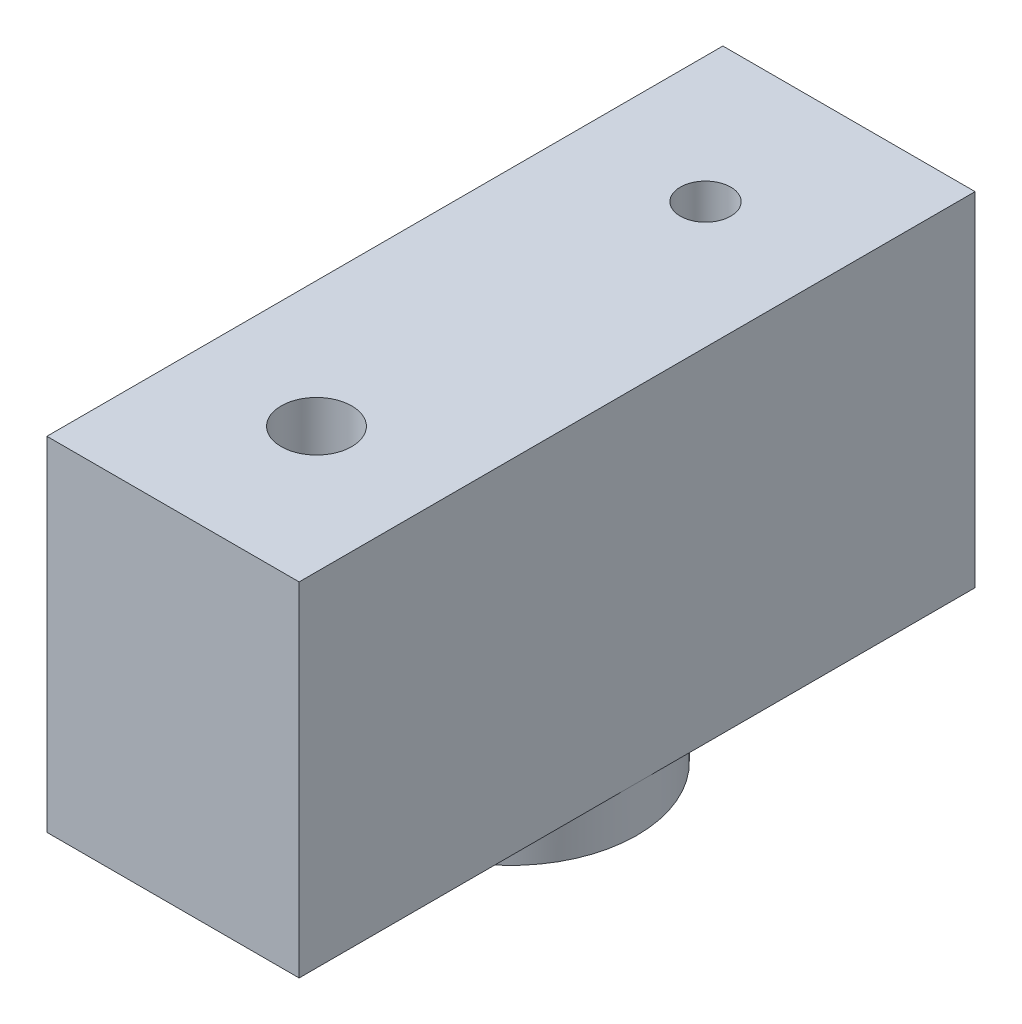
ISO-10303-21;
HEADER;
FILE_DESCRIPTION(('STEP AP214'),'2;1');
FILE_NAME('part.step','',(''),(''),'','','');
FILE_SCHEMA(('AUTOMOTIVE_DESIGN { 1 0 10303 214 1 1 1 1 }'));
ENDSEC;
DATA;
#1=APPLICATION_CONTEXT('core data for automotive mechanical design processes');
#2=APPLICATION_PROTOCOL_DEFINITION('international standard','automotive_design',2000,#1);
#3=PRODUCT_CONTEXT('',#1,'mechanical');
#4=PRODUCT('Part','Part','',(#3));
#5=PRODUCT_RELATED_PRODUCT_CATEGORY('part','',(#4));
#6=PRODUCT_DEFINITION_FORMATION('','',#4);
#7=PRODUCT_DEFINITION_CONTEXT('part definition',#1,'design');
#8=PRODUCT_DEFINITION('design','',#6,#7);
#9=PRODUCT_DEFINITION_SHAPE('','',#8);
#10=(LENGTH_UNIT() NAMED_UNIT(*) SI_UNIT(.MILLI.,.METRE.));
#11=(NAMED_UNIT(*) PLANE_ANGLE_UNIT() SI_UNIT($,.RADIAN.));
#12=(NAMED_UNIT(*) SI_UNIT($,.STERADIAN.) SOLID_ANGLE_UNIT());
#13=UNCERTAINTY_MEASURE_WITH_UNIT(LENGTH_MEASURE(1.E-05),#10,'distance_accuracy_value','');
#14=(GEOMETRIC_REPRESENTATION_CONTEXT(3) GLOBAL_UNCERTAINTY_ASSIGNED_CONTEXT((#13)) GLOBAL_UNIT_ASSIGNED_CONTEXT((#10,
#11,#12)) REPRESENTATION_CONTEXT('',''));
#15=CARTESIAN_POINT('',(0.,0.,0.));
#16=DIRECTION('',(0.,0.,1.));
#17=DIRECTION('',(1.,0.,0.));
#18=AXIS2_PLACEMENT_3D('',#15,#16,#17);
#19=CARTESIAN_POINT('',(0.,7.5,0.));
#20=DIRECTION('',(0.,-1.,0.));
#21=DIRECTION('',(0.,0.,-1.));
#22=AXIS2_PLACEMENT_3D('',#19,#20,#21);
#23=CYLINDRICAL_SURFACE('',#22,12.5);
#24=CARTESIAN_POINT('',(0.,4.5,0.));
#25=DIRECTION('',(0.,1.,0.));
#26=DIRECTION('',(0.,0.,1.));
#27=AXIS2_PLACEMENT_3D('',#24,#25,#26);
#28=CIRCLE('',#27,12.5);
#29=CARTESIAN_POINT('',(-12.5,4.5,0.));
#30=VERTEX_POINT('',#29);
#31=CARTESIAN_POINT('',(-10.1748508820344,4.5,7.2610198683356));
#32=VERTEX_POINT('',#31);
#33=EDGE_CURVE('E189',#30,#32,#28,.T.);
#34=ORIENTED_EDGE('',*,*,#33,.F.);
#35=CARTESIAN_POINT('',(12.5,4.5,0.));
#36=VERTEX_POINT('',#35);
#37=EDGE_CURVE('E179',#36,#30,#28,.T.);
#38=ORIENTED_EDGE('',*,*,#37,.F.);
#39=CARTESIAN_POINT('',(-3.34312283266417,4.5,12.0446473475033));
#40=VERTEX_POINT('',#39);
#41=EDGE_CURVE('E173',#40,#36,#28,.T.);
#42=ORIENTED_EDGE('',*,*,#41,.F.);
#43=DIRECTION('',(0.,-1.,0.));
#44=VECTOR('',#43,1.);
#45=CARTESIAN_POINT('',(-3.34312283266417,7.5,12.0446473475033));
#46=LINE('',#45,#44);
#47=CARTESIAN_POINT('',(-3.34312283266417,0.,12.0446473475033));
#48=VERTEX_POINT('',#47);
#49=EDGE_CURVE('E56',#40,#48,#46,.T.);
#50=ORIENTED_EDGE('',*,*,#49,.T.);
#51=CARTESIAN_POINT('',(0.,0.,0.));
#52=DIRECTION('',(0.,1.,0.));
#53=DIRECTION('',(0.,0.,1.));
#54=AXIS2_PLACEMENT_3D('',#51,#52,#53);
#55=CIRCLE('',#54,12.5);
#56=CARTESIAN_POINT('',(-10.1748508820344,0.,7.26101986833561));
#57=VERTEX_POINT('',#56);
#58=EDGE_CURVE('E96',#48,#57,#55,.T.);
#59=ORIENTED_EDGE('',*,*,#58,.T.);
#60=DIRECTION('',(0.,-1.,0.));
#61=VECTOR('',#60,1.);
#62=CARTESIAN_POINT('',(-10.1748508820344,7.5,7.26101986833561));
#63=LINE('',#62,#61);
#64=EDGE_CURVE('E80',#32,#57,#63,.T.);
#65=ORIENTED_EDGE('',*,*,#64,.F.);
#66=EDGE_LOOP('',(#34,#38,#42,#50,#59,#65));
#67=FACE_BOUND('',#66,.T.);
#68=ADVANCED_FACE('F46',(#67),#23,.T.);
#69=CARTESIAN_POINT('',(0.,7.5,0.));
#70=DIRECTION('',(0.,-1.,0.));
#71=DIRECTION('',(0.,0.,-1.));
#72=AXIS2_PLACEMENT_3D('',#69,#70,#71);
#73=CYLINDRICAL_SURFACE('',#72,10.);
#74=DIRECTION('',(0.,-1.,0.));
#75=VECTOR('',#74,1.);
#76=CARTESIAN_POINT('',(-8.62913745592333,7.5,5.05351231984063));
#77=LINE('',#76,#75);
#78=CARTESIAN_POINT('',(-8.62913745592333,7.5,5.05351231984063));
#79=VERTEX_POINT('',#78);
#80=CARTESIAN_POINT('',(-8.62913745592333,0.,5.05351231984063));
#81=VERTEX_POINT('',#80);
#82=EDGE_CURVE('E93',#79,#81,#77,.T.);
#83=ORIENTED_EDGE('',*,*,#82,.T.);
#84=CARTESIAN_POINT('',(0.,0.,0.));
#85=DIRECTION('',(0.,-1.,0.));
#86=DIRECTION('',(0.,0.,1.));
#87=AXIS2_PLACEMENT_3D('',#84,#85,#86);
#88=CIRCLE('',#87,10.);
#89=CARTESIAN_POINT('',(-1.79740940655315,0.,9.83713979900836));
#90=VERTEX_POINT('',#89);
#91=EDGE_CURVE('E108',#81,#90,#88,.T.);
#92=ORIENTED_EDGE('',*,*,#91,.T.);
#93=DIRECTION('',(0.,-1.,0.));
#94=VECTOR('',#93,1.);
#95=CARTESIAN_POINT('',(-1.79740940655315,7.5,9.83713979900836));
#96=LINE('',#95,#94);
#97=CARTESIAN_POINT('',(-1.79740940655315,7.5,9.83713979900836));
#98=VERTEX_POINT('',#97);
#99=EDGE_CURVE('E12',#98,#90,#96,.T.);
#100=ORIENTED_EDGE('',*,*,#99,.F.);
#101=CARTESIAN_POINT('',(0.,7.5,0.));
#102=DIRECTION('',(0.,-1.,0.));
#103=DIRECTION('',(0.,0.,1.));
#104=AXIS2_PLACEMENT_3D('',#101,#102,#103);
#105=CIRCLE('',#104,10.);
#106=EDGE_CURVE('E110',#79,#98,#105,.T.);
#107=ORIENTED_EDGE('',*,*,#106,.F.);
#108=EDGE_LOOP('',(#83,#92,#100,#107));
#109=FACE_BOUND('',#108,.T.);
#110=ADVANCED_FACE('F48',(#109),#73,.F.);
#111=CARTESIAN_POINT('',(-1.79740940655314,7.5,9.83713979900836));
#112=DIRECTION('',(0.819152044288991,0.,0.573576436351047));
#113=DIRECTION('',(0.573576436351047,0.,-0.819152044288991));
#114=AXIS2_PLACEMENT_3D('',#111,#112,#113);
#115=PLANE('',#114);
#116=ORIENTED_EDGE('',*,*,#99,.T.);
#117=DIRECTION('',(-0.573576436351047,0.,0.819152044288991));
#118=VECTOR('',#117,1.);
#119=CARTESIAN_POINT('',(-1.79740940655314,0.,9.83713979900836));
#120=LINE('',#119,#118);
#121=EDGE_CURVE('E103',#90,#48,#120,.T.);
#122=ORIENTED_EDGE('',*,*,#121,.T.);
#123=ORIENTED_EDGE('',*,*,#49,.F.);
#124=DIRECTION('',(-0.573576436351046,0.,0.819152044288992));
#125=VECTOR('',#124,1.);
#126=CARTESIAN_POINT('',(-1.79740940655315,4.5,9.83713979900836));
#127=LINE('',#126,#125);
#128=CARTESIAN_POINT('',(-12.5,4.5,25.1220232220164));
#129=VERTEX_POINT('',#128);
#130=EDGE_CURVE('E249',#40,#129,#127,.T.);
#131=ORIENTED_EDGE('',*,*,#130,.T.);
#132=DIRECTION('',(0.,1.,0.));
#133=VECTOR('',#132,1.);
#134=CARTESIAN_POINT('',(-12.5,4.5,25.1220232220164));
#135=LINE('',#134,#133);
#136=CARTESIAN_POINT('',(-12.5,17.5,25.1220232220164));
#137=VERTEX_POINT('',#136);
#138=EDGE_CURVE('E226',#129,#137,#135,.T.);
#139=ORIENTED_EDGE('',*,*,#138,.T.);
#140=DIRECTION('',(-0.573576436351051,0.,0.819152044288989));
#141=VECTOR('',#140,1.);
#142=CARTESIAN_POINT('',(-12.5,17.5,25.1220232220164));
#143=LINE('',#142,#141);
#144=CARTESIAN_POINT('',(-1.79740940655303,17.5,9.83713979900838));
#145=VERTEX_POINT('',#144);
#146=EDGE_CURVE('E298',#145,#137,#143,.T.);
#147=ORIENTED_EDGE('',*,*,#146,.F.);
#148=DIRECTION('',(0.,-1.,0.));
#149=VECTOR('',#148,1.);
#150=CARTESIAN_POINT('',(-1.79740940655303,17.5,9.83713979900838));
#151=LINE('',#150,#149);
#152=EDGE_CURVE('E283',#145,#98,#151,.T.);
#153=ORIENTED_EDGE('',*,*,#152,.T.);
#154=EDGE_LOOP('',(#116,#122,#123,#131,#139,#147,#153));
#155=FACE_BOUND('',#154,.T.);
#156=ADVANCED_FACE('F311',(#155),#115,.F.);
#157=CARTESIAN_POINT('',(-8.62913745592333,7.5,5.05351231984063));
#158=DIRECTION('',(-0.81915204428899,0.,-0.573576436351049));
#159=DIRECTION('',(-0.573576436351049,0.,0.81915204428899));
#160=AXIS2_PLACEMENT_3D('',#157,#158,#159);
#161=PLANE('',#160);
#162=ORIENTED_EDGE('',*,*,#82,.F.);
#163=DIRECTION('',(0.,-1.,0.));
#164=VECTOR('',#163,1.);
#165=CARTESIAN_POINT('',(-8.62913745592333,17.5,5.05351231984063));
#166=LINE('',#165,#164);
#167=CARTESIAN_POINT('',(-8.62913745592333,17.5,5.05351231984063));
#168=VERTEX_POINT('',#167);
#169=EDGE_CURVE('E126',#168,#79,#166,.T.);
#170=ORIENTED_EDGE('',*,*,#169,.F.);
#171=DIRECTION('',(0.573576436351051,0.,-0.819152044288989));
#172=VECTOR('',#171,1.);
#173=CARTESIAN_POINT('',(-8.62913745592333,17.5,5.05351231984063));
#174=LINE('',#173,#172);
#175=CARTESIAN_POINT('',(-12.5,17.5,10.5816769465364));
#176=VERTEX_POINT('',#175);
#177=EDGE_CURVE('E286',#176,#168,#174,.T.);
#178=ORIENTED_EDGE('',*,*,#177,.F.);
#179=DIRECTION('',(0.,1.,0.));
#180=VECTOR('',#179,1.);
#181=CARTESIAN_POINT('',(-12.5,4.5,10.5816769465364));
#182=LINE('',#181,#180);
#183=CARTESIAN_POINT('',(-12.5,4.5,10.5816769465364));
#184=VERTEX_POINT('',#183);
#185=EDGE_CURVE('E229',#184,#176,#182,.T.);
#186=ORIENTED_EDGE('',*,*,#185,.F.);
#187=DIRECTION('',(0.573576436351051,0.,-0.819152044288988));
#188=VECTOR('',#187,1.);
#189=CARTESIAN_POINT('',(-8.62913745592333,4.5,5.05351231984063));
#190=LINE('',#189,#188);
#191=EDGE_CURVE('E89',#184,#32,#190,.T.);
#192=ORIENTED_EDGE('',*,*,#191,.T.);
#193=ORIENTED_EDGE('',*,*,#64,.T.);
#194=DIRECTION('',(0.573576436351049,0.,-0.81915204428899));
#195=VECTOR('',#194,1.);
#196=CARTESIAN_POINT('',(-8.62913745592333,0.,5.05351231984063));
#197=LINE('',#196,#195);
#198=EDGE_CURVE('E85',#57,#81,#197,.T.);
#199=ORIENTED_EDGE('',*,*,#198,.T.);
#200=EDGE_LOOP('',(#162,#170,#178,#186,#192,#193,#199));
#201=FACE_BOUND('',#200,.T.);
#202=ADVANCED_FACE('F83',(#201),#161,.F.);
#203=CARTESIAN_POINT('',(0.,0.,0.));
#204=DIRECTION('',(0.,1.,0.));
#205=DIRECTION('',(0.,0.,1.));
#206=AXIS2_PLACEMENT_3D('',#203,#204,#205);
#207=PLANE('',#206);
#208=ORIENTED_EDGE('',*,*,#91,.F.);
#209=ORIENTED_EDGE('',*,*,#198,.F.);
#210=ORIENTED_EDGE('',*,*,#58,.F.);
#211=ORIENTED_EDGE('',*,*,#121,.F.);
#212=EDGE_LOOP('',(#208,#209,#210,#211));
#213=FACE_BOUND('',#212,.T.);
#214=ADVANCED_FACE('F106',(#213),#207,.F.);
#215=CARTESIAN_POINT('',(0.,4.5,0.));
#216=DIRECTION('',(0.,1.,0.));
#217=DIRECTION('',(0.,0.,1.));
#218=AXIS2_PLACEMENT_3D('',#215,#216,#217);
#219=PLANE('',#218);
#220=DIRECTION('',(0.,0.,1.));
#221=VECTOR('',#220,1.);
#222=CARTESIAN_POINT('',(-12.5,4.5,10.5816769465364));
#223=LINE('',#222,#221);
#224=EDGE_CURVE('E192',#30,#184,#223,.T.);
#225=ORIENTED_EDGE('',*,*,#224,.F.);
#226=ORIENTED_EDGE('',*,*,#33,.T.);
#227=ORIENTED_EDGE('',*,*,#191,.F.);
#228=EDGE_LOOP('',(#225,#226,#227));
#229=FACE_BOUND('',#228,.T.);
#230=ADVANCED_FACE('F193',(#229),#219,.F.);
#231=CARTESIAN_POINT('',(0.,4.5,-19.28));
#232=DIRECTION('',(0.,1.,0.));
#233=DIRECTION('',(0.,0.,1.));
#234=AXIS2_PLACEMENT_3D('',#231,#232,#233);
#235=CIRCLE('',#234,2.5);
#236=CARTESIAN_POINT('',(0.,4.5,-16.78));
#237=VERTEX_POINT('',#236);
#238=EDGE_CURVE('E197',#237,#237,#235,.T.);
#239=ORIENTED_EDGE('',*,*,#238,.T.);
#240=EDGE_LOOP('',(#239));
#241=FACE_BOUND('',#240,.T.);
#242=DIRECTION('',(0.,0.,-1.));
#243=VECTOR('',#242,1.);
#244=CARTESIAN_POINT('',(12.5,4.5,33.5));
#245=LINE('',#244,#243);
#246=CARTESIAN_POINT('',(12.5,4.5,-33.5));
#247=VERTEX_POINT('',#246);
#248=EDGE_CURVE('E186',#36,#247,#245,.T.);
#249=ORIENTED_EDGE('',*,*,#248,.F.);
#250=ORIENTED_EDGE('',*,*,#37,.T.);
#251=CARTESIAN_POINT('',(-12.5,4.5,-33.5));
#252=VERTEX_POINT('',#251);
#253=EDGE_CURVE('E184',#252,#30,#223,.T.);
#254=ORIENTED_EDGE('',*,*,#253,.F.);
#255=DIRECTION('',(-1.,0.,0.));
#256=VECTOR('',#255,1.);
#257=CARTESIAN_POINT('',(-12.5,4.5,-33.5));
#258=LINE('',#257,#256);
#259=EDGE_CURVE('E218',#247,#252,#258,.T.);
#260=ORIENTED_EDGE('',*,*,#259,.F.);
#261=EDGE_LOOP('',(#249,#250,#254,#260));
#262=FACE_BOUND('',#261,.T.);
#263=ADVANCED_FACE('F181',(#241,#262),#219,.F.);
#264=CARTESIAN_POINT('',(0.,4.5,19.28));
#265=DIRECTION('',(0.,1.,0.));
#266=DIRECTION('',(0.,0.,1.));
#267=AXIS2_PLACEMENT_3D('',#264,#265,#266);
#268=CIRCLE('',#267,3.5);
#269=CARTESIAN_POINT('',(0.,4.5,22.78));
#270=VERTEX_POINT('',#269);
#271=EDGE_CURVE('E257',#270,#270,#268,.T.);
#272=ORIENTED_EDGE('',*,*,#271,.T.);
#273=EDGE_LOOP('',(#272));
#274=FACE_BOUND('',#273,.T.);
#275=ORIENTED_EDGE('',*,*,#130,.F.);
#276=ORIENTED_EDGE('',*,*,#41,.T.);
#277=CARTESIAN_POINT('',(12.5,4.5,33.5));
#278=VERTEX_POINT('',#277);
#279=EDGE_CURVE('E235',#278,#36,#245,.T.);
#280=ORIENTED_EDGE('',*,*,#279,.F.);
#281=DIRECTION('',(1.,0.,0.));
#282=VECTOR('',#281,1.);
#283=CARTESIAN_POINT('',(-12.5,4.5,33.5));
#284=LINE('',#283,#282);
#285=CARTESIAN_POINT('',(-12.5,4.5,33.5));
#286=VERTEX_POINT('',#285);
#287=EDGE_CURVE('E240',#286,#278,#284,.T.);
#288=ORIENTED_EDGE('',*,*,#287,.F.);
#289=DIRECTION('',(0.,0.,1.));
#290=VECTOR('',#289,1.);
#291=CARTESIAN_POINT('',(-12.5,4.5,33.5));
#292=LINE('',#291,#290);
#293=EDGE_CURVE('E245',#129,#286,#292,.T.);
#294=ORIENTED_EDGE('',*,*,#293,.F.);
#295=EDGE_LOOP('',(#275,#276,#280,#288,#294));
#296=FACE_BOUND('',#295,.T.);
#297=ADVANCED_FACE('F314',(#274,#296),#219,.F.);
#298=CARTESIAN_POINT('',(-12.5,4.5,10.5816769465364));
#299=DIRECTION('',(-1.,0.,0.));
#300=DIRECTION('',(0.,0.,1.));
#301=AXIS2_PLACEMENT_3D('',#298,#299,#300);
#302=PLANE('',#301);
#303=ORIENTED_EDGE('',*,*,#185,.T.);
#304=DIRECTION('',(0.,0.,-1.));
#305=VECTOR('',#304,1.);
#306=CARTESIAN_POINT('',(-12.5,17.5,10.5816769465364));
#307=LINE('',#306,#305);
#308=EDGE_CURVE('E295',#137,#176,#307,.T.);
#309=ORIENTED_EDGE('',*,*,#308,.F.);
#310=ORIENTED_EDGE('',*,*,#138,.F.);
#311=ORIENTED_EDGE('',*,*,#293,.T.);
#312=DIRECTION('',(0.,1.,0.));
#313=VECTOR('',#312,1.);
#314=CARTESIAN_POINT('',(-12.5,4.5,33.5));
#315=LINE('',#314,#313);
#316=CARTESIAN_POINT('',(-12.5,38.5,33.5));
#317=VERTEX_POINT('',#316);
#318=EDGE_CURVE('E223',#286,#317,#315,.T.);
#319=ORIENTED_EDGE('',*,*,#318,.T.);
#320=DIRECTION('',(0.,0.,-1.));
#321=VECTOR('',#320,1.);
#322=CARTESIAN_POINT('',(-12.5,38.5,33.5));
#323=LINE('',#322,#321);
#324=CARTESIAN_POINT('',(-12.5,38.5,-33.5));
#325=VERTEX_POINT('',#324);
#326=EDGE_CURVE('E261',#317,#325,#323,.T.);
#327=ORIENTED_EDGE('',*,*,#326,.T.);
#328=DIRECTION('',(0.,1.,0.));
#329=VECTOR('',#328,1.);
#330=CARTESIAN_POINT('',(-12.5,4.5,-33.5));
#331=LINE('',#330,#329);
#332=EDGE_CURVE('E201',#252,#325,#331,.T.);
#333=ORIENTED_EDGE('',*,*,#332,.F.);
#334=ORIENTED_EDGE('',*,*,#253,.T.);
#335=ORIENTED_EDGE('',*,*,#224,.T.);
#336=EDGE_LOOP('',(#303,#309,#310,#311,#319,#327,#333,#334,#335));
#337=FACE_BOUND('',#336,.T.);
#338=ADVANCED_FACE('F199',(#337),#302,.T.);
#339=CARTESIAN_POINT('',(12.5,4.5,4.17));
#340=DIRECTION('',(1.,0.,0.));
#341=DIRECTION('',(0.,0.,-1.));
#342=AXIS2_PLACEMENT_3D('',#339,#340,#341);
#343=PLANE('',#342);
#344=ORIENTED_EDGE('',*,*,#279,.T.);
#345=ORIENTED_EDGE('',*,*,#248,.T.);
#346=DIRECTION('',(0.,1.,0.));
#347=VECTOR('',#346,1.);
#348=CARTESIAN_POINT('',(12.5,4.5,-33.5));
#349=LINE('',#348,#347);
#350=CARTESIAN_POINT('',(12.5,38.5,-33.5));
#351=VERTEX_POINT('',#350);
#352=EDGE_CURVE('E209',#247,#351,#349,.T.);
#353=ORIENTED_EDGE('',*,*,#352,.T.);
#354=DIRECTION('',(0.,0.,-1.));
#355=VECTOR('',#354,1.);
#356=CARTESIAN_POINT('',(12.5,38.5,33.5));
#357=LINE('',#356,#355);
#358=CARTESIAN_POINT('',(12.5,38.5,33.5));
#359=VERTEX_POINT('',#358);
#360=EDGE_CURVE('E268',#359,#351,#357,.T.);
#361=ORIENTED_EDGE('',*,*,#360,.F.);
#362=DIRECTION('',(0.,1.,0.));
#363=VECTOR('',#362,1.);
#364=CARTESIAN_POINT('',(12.5,4.5,33.5));
#365=LINE('',#364,#363);
#366=EDGE_CURVE('E215',#278,#359,#365,.T.);
#367=ORIENTED_EDGE('',*,*,#366,.F.);
#368=EDGE_LOOP('',(#344,#345,#353,#361,#367));
#369=FACE_BOUND('',#368,.T.);
#370=ADVANCED_FACE('F323',(#369),#343,.T.);
#371=CARTESIAN_POINT('',(-12.5,4.5,-33.5));
#372=DIRECTION('',(0.,0.,-1.));
#373=DIRECTION('',(-1.,0.,0.));
#374=AXIS2_PLACEMENT_3D('',#371,#372,#373);
#375=PLANE('',#374);
#376=ORIENTED_EDGE('',*,*,#332,.T.);
#377=DIRECTION('',(1.,0.,0.));
#378=VECTOR('',#377,1.);
#379=CARTESIAN_POINT('',(-12.5,38.5,-33.5));
#380=LINE('',#379,#378);
#381=EDGE_CURVE('E272',#325,#351,#380,.T.);
#382=ORIENTED_EDGE('',*,*,#381,.T.);
#383=ORIENTED_EDGE('',*,*,#352,.F.);
#384=ORIENTED_EDGE('',*,*,#259,.T.);
#385=EDGE_LOOP('',(#376,#382,#383,#384));
#386=FACE_BOUND('',#385,.T.);
#387=ADVANCED_FACE('F322',(#386),#375,.T.);
#388=CARTESIAN_POINT('',(-12.5,4.5,33.5));
#389=DIRECTION('',(0.,0.,1.));
#390=DIRECTION('',(1.,0.,0.));
#391=AXIS2_PLACEMENT_3D('',#388,#389,#390);
#392=PLANE('',#391);
#393=ORIENTED_EDGE('',*,*,#366,.T.);
#394=DIRECTION('',(1.,0.,0.));
#395=VECTOR('',#394,1.);
#396=CARTESIAN_POINT('',(-12.5,38.5,33.5));
#397=LINE('',#396,#395);
#398=EDGE_CURVE('E264',#317,#359,#397,.T.);
#399=ORIENTED_EDGE('',*,*,#398,.F.);
#400=ORIENTED_EDGE('',*,*,#318,.F.);
#401=ORIENTED_EDGE('',*,*,#287,.T.);
#402=EDGE_LOOP('',(#393,#399,#400,#401));
#403=FACE_BOUND('',#402,.T.);
#404=ADVANCED_FACE('F316',(#403),#392,.T.);
#405=CARTESIAN_POINT('',(0.,4.5,-19.28));
#406=DIRECTION('',(0.,1.,0.));
#407=DIRECTION('',(0.,0.,1.));
#408=AXIS2_PLACEMENT_3D('',#405,#406,#407);
#409=CYLINDRICAL_SURFACE('',#408,2.5);
#410=ORIENTED_EDGE('',*,*,#238,.F.);
#411=EDGE_LOOP('',(#410));
#412=FACE_BOUND('',#411,.T.);
#413=CARTESIAN_POINT('',(0.,38.5,-19.28));
#414=DIRECTION('',(0.,-1.,0.));
#415=DIRECTION('',(0.,0.,-1.));
#416=AXIS2_PLACEMENT_3D('',#413,#414,#415);
#417=CIRCLE('',#416,2.5);
#418=CARTESIAN_POINT('',(0.,38.5,-21.78));
#419=VERTEX_POINT('',#418);
#420=EDGE_CURVE('E279',#419,#419,#417,.T.);
#421=ORIENTED_EDGE('',*,*,#420,.F.);
#422=EDGE_LOOP('',(#421));
#423=FACE_BOUND('',#422,.T.);
#424=ADVANCED_FACE('F353',(#412,#423),#409,.F.);
#425=CARTESIAN_POINT('',(0.,4.5,19.28));
#426=DIRECTION('',(0.,1.,0.));
#427=DIRECTION('',(0.,0.,1.));
#428=AXIS2_PLACEMENT_3D('',#425,#426,#427);
#429=CYLINDRICAL_SURFACE('',#428,3.5);
#430=ORIENTED_EDGE('',*,*,#271,.F.);
#431=EDGE_LOOP('',(#430));
#432=FACE_BOUND('',#431,.T.);
#433=CARTESIAN_POINT('',(0.,38.5,19.28));
#434=DIRECTION('',(0.,-1.,0.));
#435=DIRECTION('',(0.,0.,-1.));
#436=AXIS2_PLACEMENT_3D('',#433,#434,#435);
#437=CIRCLE('',#436,3.5);
#438=CARTESIAN_POINT('',(0.,38.5,15.78));
#439=VERTEX_POINT('',#438);
#440=EDGE_CURVE('E275',#439,#439,#437,.T.);
#441=ORIENTED_EDGE('',*,*,#440,.F.);
#442=EDGE_LOOP('',(#441));
#443=FACE_BOUND('',#442,.T.);
#444=ADVANCED_FACE('F358',(#432,#443),#429,.F.);
#445=CARTESIAN_POINT('',(0.,38.5,0.));
#446=DIRECTION('',(0.,1.,0.));
#447=DIRECTION('',(0.,0.,1.));
#448=AXIS2_PLACEMENT_3D('',#445,#446,#447);
#449=PLANE('',#448);
#450=ORIENTED_EDGE('',*,*,#420,.T.);
#451=EDGE_LOOP('',(#450));
#452=FACE_BOUND('',#451,.T.);
#453=ORIENTED_EDGE('',*,*,#440,.T.);
#454=EDGE_LOOP('',(#453));
#455=FACE_BOUND('',#454,.T.);
#456=ORIENTED_EDGE('',*,*,#381,.F.);
#457=ORIENTED_EDGE('',*,*,#326,.F.);
#458=ORIENTED_EDGE('',*,*,#398,.T.);
#459=ORIENTED_EDGE('',*,*,#360,.T.);
#460=EDGE_LOOP('',(#456,#457,#458,#459));
#461=FACE_BOUND('',#460,.T.);
#462=ADVANCED_FACE('F320',(#452,#455,#461),#449,.T.);
#463=CARTESIAN_POINT('',(0.,7.5,0.));
#464=DIRECTION('',(0.,1.,0.));
#465=DIRECTION('',(0.,0.,1.));
#466=AXIS2_PLACEMENT_3D('',#463,#464,#465);
#467=PLANE('',#466);
#468=ORIENTED_EDGE('',*,*,#106,.T.);
#469=CARTESIAN_POINT('',(0.,7.5,0.));
#470=DIRECTION('',(0.,1.,0.));
#471=DIRECTION('',(0.,0.,1.));
#472=AXIS2_PLACEMENT_3D('',#469,#470,#471);
#473=CIRCLE('',#472,10.);
#474=EDGE_CURVE('E63',#79,#98,#473,.T.);
#475=ORIENTED_EDGE('',*,*,#474,.F.);
#476=EDGE_LOOP('',(#468,#475));
#477=FACE_BOUND('',#476,.T.);
#478=ADVANCED_FACE('F369',(#477),#467,.F.);
#479=CARTESIAN_POINT('',(0.,17.5,0.));
#480=DIRECTION('',(0.,-1.,0.));
#481=DIRECTION('',(0.,0.,-1.));
#482=AXIS2_PLACEMENT_3D('',#479,#480,#481);
#483=CYLINDRICAL_SURFACE('',#482,10.);
#484=ORIENTED_EDGE('',*,*,#474,.T.);
#485=ORIENTED_EDGE('',*,*,#152,.F.);
#486=CARTESIAN_POINT('',(0.,17.5,0.));
#487=DIRECTION('',(0.,1.,0.));
#488=DIRECTION('',(0.,0.,1.));
#489=AXIS2_PLACEMENT_3D('',#486,#487,#488);
#490=CIRCLE('',#489,10.);
#491=EDGE_CURVE('E291',#168,#145,#490,.T.);
#492=ORIENTED_EDGE('',*,*,#491,.F.);
#493=ORIENTED_EDGE('',*,*,#169,.T.);
#494=EDGE_LOOP('',(#484,#485,#492,#493));
#495=FACE_BOUND('',#494,.T.);
#496=ADVANCED_FACE('F307',(#495),#483,.T.);
#497=CARTESIAN_POINT('',(0.,17.5,0.));
#498=DIRECTION('',(0.,1.,0.));
#499=DIRECTION('',(0.,0.,1.));
#500=AXIS2_PLACEMENT_3D('',#497,#498,#499);
#501=PLANE('',#500);
#502=ORIENTED_EDGE('',*,*,#491,.T.);
#503=ORIENTED_EDGE('',*,*,#146,.T.);
#504=ORIENTED_EDGE('',*,*,#308,.T.);
#505=ORIENTED_EDGE('',*,*,#177,.T.);
#506=EDGE_LOOP('',(#502,#503,#504,#505));
#507=FACE_BOUND('',#506,.T.);
#508=ADVANCED_FACE('F305',(#507),#501,.F.);
#509=CLOSED_SHELL('',(#68,#110,#156,#202,#214,#230,#263,#297,#338,#370,#387,#404,#424,#444,#462,
#478,#496,#508));
#510=MANIFOLD_SOLID_BREP('B2',#509);
#511=ADVANCED_BREP_SHAPE_REPRESENTATION('',(#18,#510),#14);
#512=SHAPE_DEFINITION_REPRESENTATION(#9,#511);
ENDSEC;
END-ISO-10303-21;
